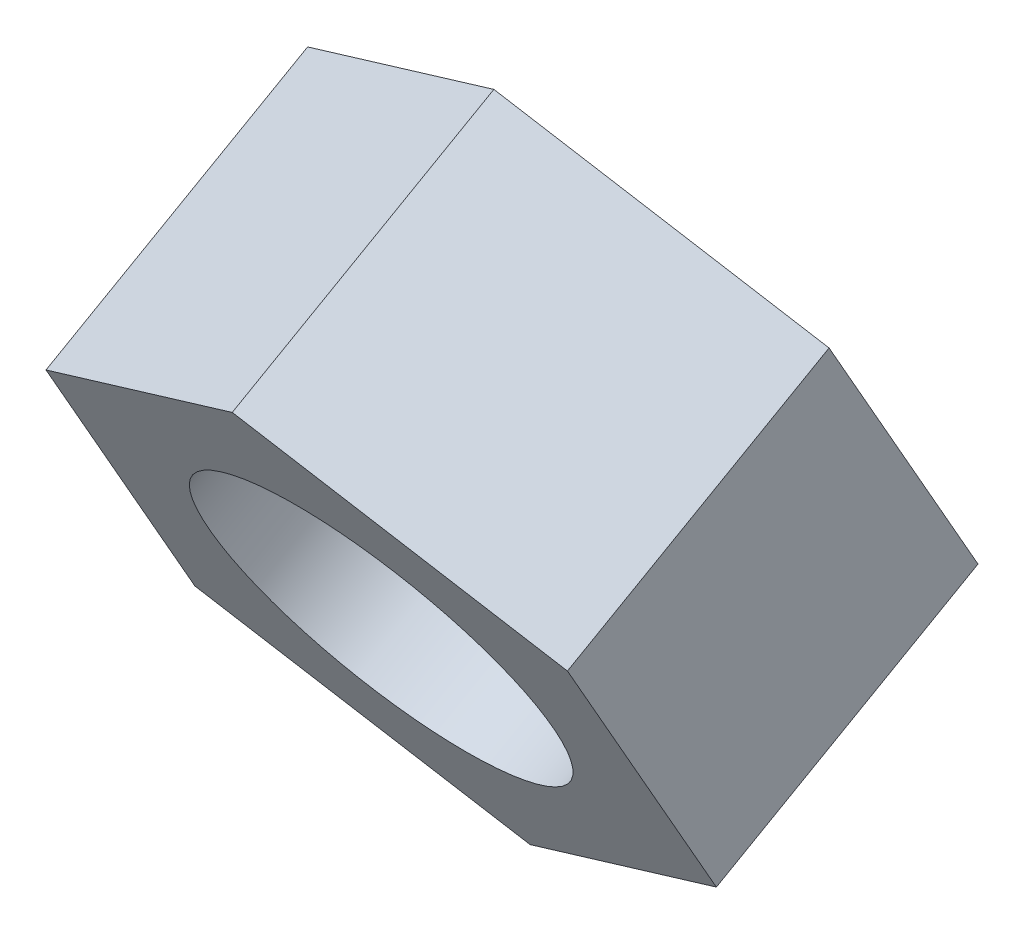
ISO-10303-21;
HEADER;
FILE_DESCRIPTION(('STEP AP214'),'2;1');
FILE_NAME('part.step','',(''),(''),'','','');
FILE_SCHEMA(('AUTOMOTIVE_DESIGN { 1 0 10303 214 1 1 1 1 }'));
ENDSEC;
DATA;
#1=APPLICATION_CONTEXT('core data for automotive mechanical design processes');
#2=APPLICATION_PROTOCOL_DEFINITION('international standard','automotive_design',2000,#1);
#3=PRODUCT_CONTEXT('',#1,'mechanical');
#4=PRODUCT('Part','Part','',(#3));
#5=PRODUCT_RELATED_PRODUCT_CATEGORY('part','',(#4));
#6=PRODUCT_DEFINITION_FORMATION('','',#4);
#7=PRODUCT_DEFINITION_CONTEXT('part definition',#1,'design');
#8=PRODUCT_DEFINITION('design','',#6,#7);
#9=PRODUCT_DEFINITION_SHAPE('','',#8);
#10=(LENGTH_UNIT() NAMED_UNIT(*) SI_UNIT(.MILLI.,.METRE.));
#11=(NAMED_UNIT(*) PLANE_ANGLE_UNIT() SI_UNIT($,.RADIAN.));
#12=(NAMED_UNIT(*) SI_UNIT($,.STERADIAN.) SOLID_ANGLE_UNIT());
#13=UNCERTAINTY_MEASURE_WITH_UNIT(LENGTH_MEASURE(1.E-05),#10,'distance_accuracy_value','');
#14=(GEOMETRIC_REPRESENTATION_CONTEXT(3) GLOBAL_UNCERTAINTY_ASSIGNED_CONTEXT((#13)) GLOBAL_UNIT_ASSIGNED_CONTEXT((#10,
#11,#12)) REPRESENTATION_CONTEXT('',''));
#15=CARTESIAN_POINT('',(0.,0.,0.));
#16=DIRECTION('',(0.,0.,1.));
#17=DIRECTION('',(1.,0.,0.));
#18=AXIS2_PLACEMENT_3D('',#15,#16,#17);
#19=CARTESIAN_POINT('',(0.,39.8605623443285,-70.0180809320989));
#20=DIRECTION('',(0.,-0.494736971942379,0.869042765687216));
#21=DIRECTION('',(0.,-0.869042765687216,-0.494736971942379));
#22=AXIS2_PLACEMENT_3D('',#19,#20,#21);
#23=PLANE('',#22);
#24=DIRECTION('',(0.,0.869042765687216,0.494736971942379));
#25=VECTOR('',#24,1.);
#26=CARTESIAN_POINT('',(6.06217782649106,82.1571641769782,-45.9390671708025));
#27=LINE('',#26,#25);
#28=CARTESIAN_POINT('',(6.06217782649106,82.1571641769782,-45.9390671708025));
#29=VERTEX_POINT('',#28);
#30=CARTESIAN_POINT('',(6.06217782649106,88.2404635367887,-42.4759083672058));
#31=VERTEX_POINT('',#30);
#32=EDGE_CURVE('E135',#29,#31,#27,.T.);
#33=ORIENTED_EDGE('',*,*,#32,.T.);
#34=DIRECTION('',(-0.866025403784439,0.434521382843608,0.247368485971189));
#35=VECTOR('',#34,1.);
#36=CARTESIAN_POINT('',(6.06217782649106,88.2404635367887,-42.4759083672058));
#37=LINE('',#36,#35);
#38=CARTESIAN_POINT('',(0.,91.282113216694,-40.7443289654075));
#39=VERTEX_POINT('',#38);
#40=EDGE_CURVE('E93',#31,#39,#37,.T.);
#41=ORIENTED_EDGE('',*,*,#40,.T.);
#42=DIRECTION('',(-0.866025403784439,-0.434521382843608,-0.24736848597119));
#43=VECTOR('',#42,1.);
#44=CARTESIAN_POINT('',(0.,91.282113216694,-40.7443289654075));
#45=LINE('',#44,#43);
#46=CARTESIAN_POINT('',(-6.06217782649106,88.2404635367887,-42.4759083672058));
#47=VERTEX_POINT('',#46);
#48=EDGE_CURVE('E106',#39,#47,#45,.T.);
#49=ORIENTED_EDGE('',*,*,#48,.T.);
#50=DIRECTION('',(0.,-0.869042765687216,-0.494736971942379));
#51=VECTOR('',#50,1.);
#52=CARTESIAN_POINT('',(-6.06217782649106,88.2404635367887,-42.4759083672058));
#53=LINE('',#52,#51);
#54=CARTESIAN_POINT('',(-6.06217782649106,82.1571641769782,-45.9390671708025));
#55=VERTEX_POINT('',#54);
#56=EDGE_CURVE('E100',#47,#55,#53,.T.);
#57=ORIENTED_EDGE('',*,*,#56,.T.);
#58=DIRECTION('',(0.866025403784438,-0.434521382843608,-0.247368485971191));
#59=VECTOR('',#58,1.);
#60=CARTESIAN_POINT('',(-6.06217782649106,82.1571641769782,-45.9390671708025));
#61=LINE('',#60,#59);
#62=CARTESIAN_POINT('',(0.,79.115514497073,-47.6706465726008));
#63=VERTEX_POINT('',#62);
#64=EDGE_CURVE('E104',#55,#63,#61,.T.);
#65=ORIENTED_EDGE('',*,*,#64,.T.);
#66=DIRECTION('',(0.866025403784438,0.434521382843608,0.24736848597119));
#67=VECTOR('',#66,1.);
#68=CARTESIAN_POINT('',(0.,79.115514497073,-47.6706465726008));
#69=LINE('',#68,#67);
#70=EDGE_CURVE('E56',#63,#29,#69,.T.);
#71=ORIENTED_EDGE('',*,*,#70,.T.);
#72=EDGE_LOOP('',(#33,#41,#49,#57,#65,#71));
#73=FACE_BOUND('',#72,.T.);
#74=CARTESIAN_POINT('',(0.,85.1988138568835,-44.2074877690041));
#75=DIRECTION('',(0.,-0.494736971942379,0.869042765687216));
#76=DIRECTION('',(0.,-0.869042765687216,-0.494736971942379));
#77=AXIS2_PLACEMENT_3D('',#74,#75,#76);
#78=CIRCLE('',#77,4.00000000000001);
#79=CARTESIAN_POINT('',(0.,81.7226427941346,-46.1864356567737));
#80=VERTEX_POINT('',#79);
#81=EDGE_CURVE('E128',#80,#80,#78,.T.);
#82=ORIENTED_EDGE('',*,*,#81,.F.);
#83=EDGE_LOOP('',(#82));
#84=FACE_BOUND('',#83,.T.);
#85=ADVANCED_FACE('F39',(#73,#84),#23,.T.);
#86=CARTESIAN_POINT('',(0.,43.3237211479252,-76.1013802919094));
#87=DIRECTION('',(0.,-0.494736971942379,0.869042765687216));
#88=DIRECTION('',(0.,-0.869042765687216,-0.494736971942379));
#89=AXIS2_PLACEMENT_3D('',#86,#87,#88);
#90=PLANE('',#89);
#91=DIRECTION('',(0.,0.869042765687216,0.494736971942379));
#92=VECTOR('',#91,1.);
#93=CARTESIAN_POINT('',(6.06217782649106,85.6203229805749,-52.022366530613));
#94=LINE('',#93,#92);
#95=CARTESIAN_POINT('',(6.06217782649106,85.6203229805749,-52.022366530613));
#96=VERTEX_POINT('',#95);
#97=CARTESIAN_POINT('',(6.06217782649106,91.7036223403854,-48.5592077270163));
#98=VERTEX_POINT('',#97);
#99=EDGE_CURVE('E124',#96,#98,#94,.T.);
#100=ORIENTED_EDGE('',*,*,#99,.F.);
#101=DIRECTION('',(0.866025403784438,0.434521382843608,0.24736848597119));
#102=VECTOR('',#101,1.);
#103=CARTESIAN_POINT('',(0.,82.5786733006696,-53.7539459324113));
#104=LINE('',#103,#102);
#105=CARTESIAN_POINT('',(0.,82.5786733006696,-53.7539459324113));
#106=VERTEX_POINT('',#105);
#107=EDGE_CURVE('E85',#106,#96,#104,.T.);
#108=ORIENTED_EDGE('',*,*,#107,.F.);
#109=DIRECTION('',(0.866025403784438,-0.434521382843608,-0.247368485971191));
#110=VECTOR('',#109,1.);
#111=CARTESIAN_POINT('',(-6.06217782649106,85.6203229805749,-52.022366530613));
#112=LINE('',#111,#110);
#113=CARTESIAN_POINT('',(-6.06217782649106,85.6203229805749,-52.022366530613));
#114=VERTEX_POINT('',#113);
#115=EDGE_CURVE('E79',#114,#106,#112,.T.);
#116=ORIENTED_EDGE('',*,*,#115,.F.);
#117=DIRECTION('',(0.,-0.869042765687216,-0.494736971942379));
#118=VECTOR('',#117,1.);
#119=CARTESIAN_POINT('',(-6.06217782649106,91.7036223403854,-48.5592077270163));
#120=LINE('',#119,#118);
#121=CARTESIAN_POINT('',(-6.06217782649106,91.7036223403854,-48.5592077270163));
#122=VERTEX_POINT('',#121);
#123=EDGE_CURVE('E114',#122,#114,#120,.T.);
#124=ORIENTED_EDGE('',*,*,#123,.F.);
#125=DIRECTION('',(-0.866025403784439,-0.434521382843608,-0.24736848597119));
#126=VECTOR('',#125,1.);
#127=CARTESIAN_POINT('',(0.,94.7452720202907,-46.827628325218));
#128=LINE('',#127,#126);
#129=CARTESIAN_POINT('',(0.,94.7452720202907,-46.827628325218));
#130=VERTEX_POINT('',#129);
#131=EDGE_CURVE('E130',#130,#122,#128,.T.);
#132=ORIENTED_EDGE('',*,*,#131,.F.);
#133=DIRECTION('',(-0.866025403784439,0.434521382843608,0.247368485971189));
#134=VECTOR('',#133,1.);
#135=CARTESIAN_POINT('',(6.06217782649106,91.7036223403854,-48.5592077270163));
#136=LINE('',#135,#134);
#137=EDGE_CURVE('E127',#98,#130,#136,.T.);
#138=ORIENTED_EDGE('',*,*,#137,.F.);
#139=EDGE_LOOP('',(#100,#108,#116,#124,#132,#138));
#140=FACE_BOUND('',#139,.T.);
#141=CARTESIAN_POINT('',(0.,88.6619726604801,-50.2907871288147));
#142=DIRECTION('',(0.,-0.494736971942379,0.869042765687216));
#143=DIRECTION('',(0.,-0.869042765687216,-0.494736971942379));
#144=AXIS2_PLACEMENT_3D('',#141,#142,#143);
#145=CIRCLE('',#144,4.00000000000001);
#146=CARTESIAN_POINT('',(0.,85.1858015977312,-52.2697350165842));
#147=VERTEX_POINT('',#146);
#148=EDGE_CURVE('E228',#147,#147,#145,.T.);
#149=ORIENTED_EDGE('',*,*,#148,.T.);
#150=EDGE_LOOP('',(#149));
#151=FACE_BOUND('',#150,.T.);
#152=ADVANCED_FACE('F144',(#140,#151),#90,.F.);
#153=CARTESIAN_POINT('',(6.06217782649106,82.1571641769782,-45.9390671708025));
#154=DIRECTION('',(-1.,0.,0.));
#155=DIRECTION('',(0.,0.,1.));
#156=AXIS2_PLACEMENT_3D('',#153,#154,#155);
#157=PLANE('',#156);
#158=ORIENTED_EDGE('',*,*,#99,.T.);
#159=DIRECTION('',(0.,0.494736971942379,-0.869042765687216));
#160=VECTOR('',#159,1.);
#161=CARTESIAN_POINT('',(6.06217782649106,88.2404635367887,-42.4759083672058));
#162=LINE('',#161,#160);
#163=EDGE_CURVE('E11',#31,#98,#162,.T.);
#164=ORIENTED_EDGE('',*,*,#163,.F.);
#165=ORIENTED_EDGE('',*,*,#32,.F.);
#166=DIRECTION('',(0.,0.494736971942379,-0.869042765687216));
#167=VECTOR('',#166,1.);
#168=CARTESIAN_POINT('',(6.06217782649106,82.1571641769782,-45.9390671708025));
#169=LINE('',#168,#167);
#170=EDGE_CURVE('E120',#29,#96,#169,.T.);
#171=ORIENTED_EDGE('',*,*,#170,.T.);
#172=EDGE_LOOP('',(#158,#164,#165,#171));
#173=FACE_BOUND('',#172,.T.);
#174=ADVANCED_FACE('F41',(#173),#157,.F.);
#175=CARTESIAN_POINT('',(6.06217782649106,88.2404635367887,-42.4759083672058));
#176=DIRECTION('',(-0.5,-0.752613112060217,-0.42845478589349));
#177=DIRECTION('',(0.832939072330605,-0.553364709558742,0.));
#178=AXIS2_PLACEMENT_3D('',#175,#176,#177);
#179=PLANE('',#178);
#180=ORIENTED_EDGE('',*,*,#137,.T.);
#181=DIRECTION('',(0.,0.494736971942379,-0.869042765687216));
#182=VECTOR('',#181,1.);
#183=CARTESIAN_POINT('',(0.,91.282113216694,-40.7443289654075));
#184=LINE('',#183,#182);
#185=EDGE_CURVE('E48',#39,#130,#184,.T.);
#186=ORIENTED_EDGE('',*,*,#185,.F.);
#187=ORIENTED_EDGE('',*,*,#40,.F.);
#188=ORIENTED_EDGE('',*,*,#163,.T.);
#189=EDGE_LOOP('',(#180,#186,#187,#188));
#190=FACE_BOUND('',#189,.T.);
#191=ADVANCED_FACE('F172',(#190),#179,.F.);
#192=CARTESIAN_POINT('',(0.,91.282113216694,-40.7443289654075));
#193=DIRECTION('',(0.5,-0.752613112060217,-0.42845478589349));
#194=DIRECTION('',(0.832939072330605,0.553364709558742,0.));
#195=AXIS2_PLACEMENT_3D('',#192,#193,#194);
#196=PLANE('',#195);
#197=ORIENTED_EDGE('',*,*,#131,.T.);
#198=DIRECTION('',(0.,0.494736971942379,-0.869042765687216));
#199=VECTOR('',#198,1.);
#200=CARTESIAN_POINT('',(-6.06217782649106,88.2404635367887,-42.4759083672058));
#201=LINE('',#200,#199);
#202=EDGE_CURVE('E115',#47,#122,#201,.T.);
#203=ORIENTED_EDGE('',*,*,#202,.F.);
#204=ORIENTED_EDGE('',*,*,#48,.F.);
#205=ORIENTED_EDGE('',*,*,#185,.T.);
#206=EDGE_LOOP('',(#197,#203,#204,#205));
#207=FACE_BOUND('',#206,.T.);
#208=ADVANCED_FACE('F141',(#207),#196,.F.);
#209=CARTESIAN_POINT('',(-6.06217782649106,88.2404635367887,-42.4759083672058));
#210=DIRECTION('',(1.,0.,0.));
#211=DIRECTION('',(0.,1.,0.));
#212=AXIS2_PLACEMENT_3D('',#209,#210,#211);
#213=PLANE('',#212);
#214=ORIENTED_EDGE('',*,*,#123,.T.);
#215=DIRECTION('',(0.,0.494736971942379,-0.869042765687216));
#216=VECTOR('',#215,1.);
#217=CARTESIAN_POINT('',(-6.06217782649106,82.1571641769782,-45.9390671708025));
#218=LINE('',#217,#216);
#219=EDGE_CURVE('E111',#55,#114,#218,.T.);
#220=ORIENTED_EDGE('',*,*,#219,.F.);
#221=ORIENTED_EDGE('',*,*,#56,.F.);
#222=ORIENTED_EDGE('',*,*,#202,.T.);
#223=EDGE_LOOP('',(#214,#220,#221,#222));
#224=FACE_BOUND('',#223,.T.);
#225=ADVANCED_FACE('F112',(#224),#213,.F.);
#226=CARTESIAN_POINT('',(-6.06217782649106,82.1571641769782,-45.9390671708025));
#227=DIRECTION('',(0.5,0.752613112060216,0.428454785893489));
#228=DIRECTION('',(-0.832939072330605,0.553364709558742,0.));
#229=AXIS2_PLACEMENT_3D('',#226,#227,#228);
#230=PLANE('',#229);
#231=ORIENTED_EDGE('',*,*,#115,.T.);
#232=DIRECTION('',(0.,0.494736971942379,-0.869042765687216));
#233=VECTOR('',#232,1.);
#234=CARTESIAN_POINT('',(0.,79.115514497073,-47.6706465726008));
#235=LINE('',#234,#233);
#236=EDGE_CURVE('E116',#63,#106,#235,.T.);
#237=ORIENTED_EDGE('',*,*,#236,.F.);
#238=ORIENTED_EDGE('',*,*,#64,.F.);
#239=ORIENTED_EDGE('',*,*,#219,.T.);
#240=EDGE_LOOP('',(#231,#237,#238,#239));
#241=FACE_BOUND('',#240,.T.);
#242=ADVANCED_FACE('F118',(#241),#230,.F.);
#243=CARTESIAN_POINT('',(0.,79.115514497073,-47.6706465726008));
#244=DIRECTION('',(-0.5,0.752613112060217,0.42845478589349));
#245=DIRECTION('',(-0.832939072330605,-0.553364709558742,0.));
#246=AXIS2_PLACEMENT_3D('',#243,#244,#245);
#247=PLANE('',#246);
#248=ORIENTED_EDGE('',*,*,#107,.T.);
#249=ORIENTED_EDGE('',*,*,#170,.F.);
#250=ORIENTED_EDGE('',*,*,#70,.F.);
#251=ORIENTED_EDGE('',*,*,#236,.T.);
#252=EDGE_LOOP('',(#248,#249,#250,#251));
#253=FACE_BOUND('',#252,.T.);
#254=ADVANCED_FACE('F149',(#253),#247,.F.);
#255=CARTESIAN_POINT('',(0.,85.1988138568835,-44.2074877690041));
#256=DIRECTION('',(0.,0.494736971942379,-0.869042765687216));
#257=DIRECTION('',(0.,0.869042765687216,0.494736971942379));
#258=AXIS2_PLACEMENT_3D('',#255,#256,#257);
#259=CYLINDRICAL_SURFACE('',#258,4.00000000000001);
#260=ORIENTED_EDGE('',*,*,#81,.T.);
#261=EDGE_LOOP('',(#260));
#262=FACE_BOUND('',#261,.T.);
#263=ORIENTED_EDGE('',*,*,#148,.F.);
#264=EDGE_LOOP('',(#263));
#265=FACE_BOUND('',#264,.T.);
#266=ADVANCED_FACE('F151',(#262,#265),#259,.F.);
#267=CLOSED_SHELL('',(#85,#152,#174,#191,#208,#225,#242,#254,#266));
#268=MANIFOLD_SOLID_BREP('B2',#267);
#269=ADVANCED_BREP_SHAPE_REPRESENTATION('',(#18,#268),#14);
#270=SHAPE_DEFINITION_REPRESENTATION(#9,#269);
ENDSEC;
END-ISO-10303-21;
